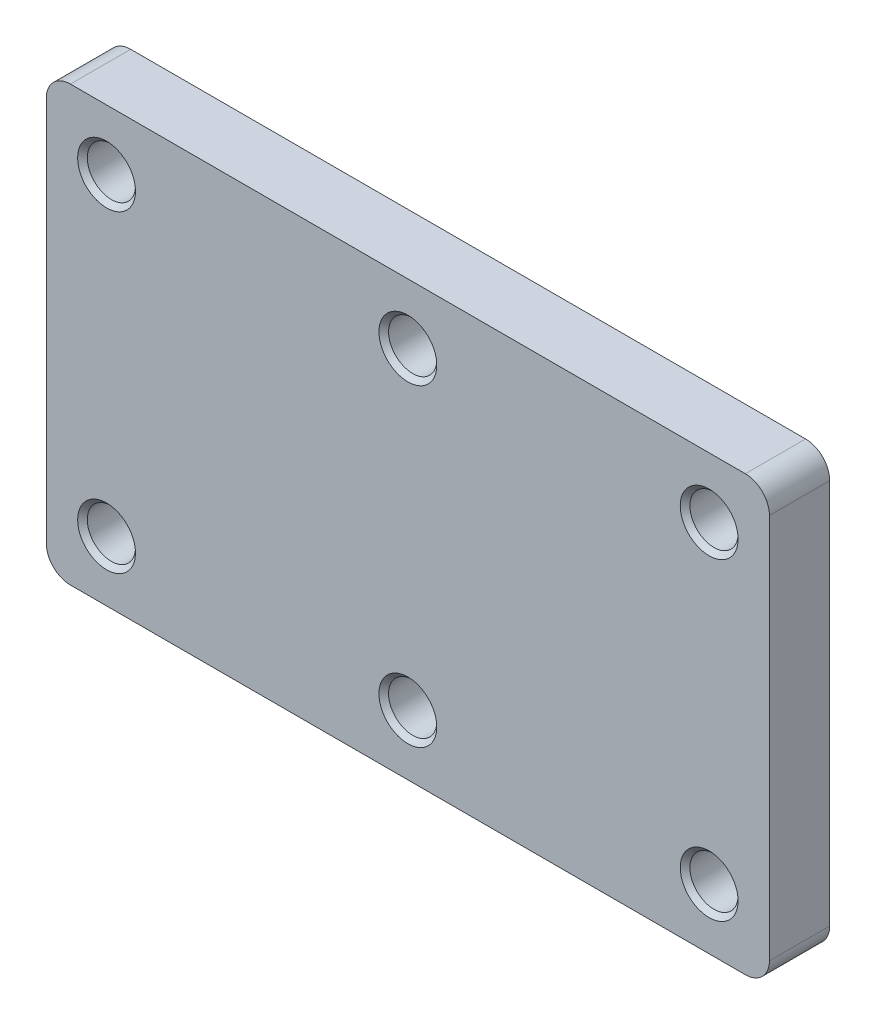
ISO-10303-21;
HEADER;
FILE_DESCRIPTION(('STEP AP214'),'2;1');
FILE_NAME('part.step','',(''),(''),'','','');
FILE_SCHEMA(('AUTOMOTIVE_DESIGN { 1 0 10303 214 1 1 1 1 }'));
ENDSEC;
DATA;
#1=APPLICATION_CONTEXT('core data for automotive mechanical design processes');
#2=APPLICATION_PROTOCOL_DEFINITION('international standard','automotive_design',2000,#1);
#3=PRODUCT_CONTEXT('',#1,'mechanical');
#4=PRODUCT('Part','Part','',(#3));
#5=PRODUCT_RELATED_PRODUCT_CATEGORY('part','',(#4));
#6=PRODUCT_DEFINITION_FORMATION('','',#4);
#7=PRODUCT_DEFINITION_CONTEXT('part definition',#1,'design');
#8=PRODUCT_DEFINITION('design','',#6,#7);
#9=PRODUCT_DEFINITION_SHAPE('','',#8);
#10=(LENGTH_UNIT() NAMED_UNIT(*) SI_UNIT(.MILLI.,.METRE.));
#11=(NAMED_UNIT(*) PLANE_ANGLE_UNIT() SI_UNIT($,.RADIAN.));
#12=(NAMED_UNIT(*) SI_UNIT($,.STERADIAN.) SOLID_ANGLE_UNIT());
#13=UNCERTAINTY_MEASURE_WITH_UNIT(LENGTH_MEASURE(1.E-05),#10,'distance_accuracy_value','');
#14=(GEOMETRIC_REPRESENTATION_CONTEXT(3) GLOBAL_UNCERTAINTY_ASSIGNED_CONTEXT((#13)) GLOBAL_UNIT_ASSIGNED_CONTEXT((#10,
#11,#12)) REPRESENTATION_CONTEXT('',''));
#15=CARTESIAN_POINT('',(0.,0.,0.));
#16=DIRECTION('',(0.,0.,1.));
#17=DIRECTION('',(1.,0.,0.));
#18=AXIS2_PLACEMENT_3D('',#15,#16,#17);
#19=CARTESIAN_POINT('',(0.,0.,25.));
#20=DIRECTION('',(0.,0.,-1.));
#21=DIRECTION('',(-1.,0.,0.));
#22=AXIS2_PLACEMENT_3D('',#19,#20,#21);
#23=PLANE('',#22);
#24=CARTESIAN_POINT('',(275.,25.,25.));
#25=DIRECTION('',(0.,0.,-1.));
#26=DIRECTION('',(-1.,0.,0.));
#27=AXIS2_PLACEMENT_3D('',#24,#25,#26);
#28=CIRCLE('',#27,12.);
#29=CARTESIAN_POINT('',(263.,25.,25.));
#30=VERTEX_POINT('',#29);
#31=EDGE_CURVE('E184',#30,#30,#28,.T.);
#32=ORIENTED_EDGE('',*,*,#31,.T.);
#33=EDGE_LOOP('',(#32));
#34=FACE_BOUND('',#33,.T.);
#35=CARTESIAN_POINT('',(275.,155.,25.));
#36=DIRECTION('',(0.,0.,-1.));
#37=DIRECTION('',(-1.,0.,0.));
#38=AXIS2_PLACEMENT_3D('',#35,#36,#37);
#39=CIRCLE('',#38,12.);
#40=CARTESIAN_POINT('',(263.,155.,25.));
#41=VERTEX_POINT('',#40);
#42=EDGE_CURVE('E181',#41,#41,#39,.T.);
#43=ORIENTED_EDGE('',*,*,#42,.T.);
#44=EDGE_LOOP('',(#43));
#45=FACE_BOUND('',#44,.T.);
#46=CARTESIAN_POINT('',(150.,155.,25.));
#47=DIRECTION('',(0.,0.,-1.));
#48=DIRECTION('',(-1.,0.,0.));
#49=AXIS2_PLACEMENT_3D('',#46,#47,#48);
#50=CIRCLE('',#49,12.);
#51=CARTESIAN_POINT('',(138.,155.,25.));
#52=VERTEX_POINT('',#51);
#53=EDGE_CURVE('E178',#52,#52,#50,.T.);
#54=ORIENTED_EDGE('',*,*,#53,.T.);
#55=EDGE_LOOP('',(#54));
#56=FACE_BOUND('',#55,.T.);
#57=CARTESIAN_POINT('',(25.,155.,25.));
#58=DIRECTION('',(0.,0.,-1.));
#59=DIRECTION('',(-1.,0.,0.));
#60=AXIS2_PLACEMENT_3D('',#57,#58,#59);
#61=CIRCLE('',#60,11.9999999999999);
#62=CARTESIAN_POINT('',(13.0000000000001,155.,25.));
#63=VERTEX_POINT('',#62);
#64=EDGE_CURVE('E175',#63,#63,#61,.T.);
#65=ORIENTED_EDGE('',*,*,#64,.T.);
#66=EDGE_LOOP('',(#65));
#67=FACE_BOUND('',#66,.T.);
#68=CARTESIAN_POINT('',(150.,25.,25.));
#69=DIRECTION('',(0.,0.,-1.));
#70=DIRECTION('',(-1.,0.,0.));
#71=AXIS2_PLACEMENT_3D('',#68,#69,#70);
#72=CIRCLE('',#71,12.);
#73=CARTESIAN_POINT('',(138.,25.,25.));
#74=VERTEX_POINT('',#73);
#75=EDGE_CURVE('E172',#74,#74,#72,.T.);
#76=ORIENTED_EDGE('',*,*,#75,.T.);
#77=EDGE_LOOP('',(#76));
#78=FACE_BOUND('',#77,.T.);
#79=CARTESIAN_POINT('',(25.,25.,25.));
#80=DIRECTION('',(0.,0.,-1.));
#81=DIRECTION('',(-1.,0.,0.));
#82=AXIS2_PLACEMENT_3D('',#79,#80,#81);
#83=CIRCLE('',#82,11.9999999999999);
#84=CARTESIAN_POINT('',(13.0000000000001,25.,25.));
#85=VERTEX_POINT('',#84);
#86=EDGE_CURVE('E169',#85,#85,#83,.T.);
#87=ORIENTED_EDGE('',*,*,#86,.T.);
#88=EDGE_LOOP('',(#87));
#89=FACE_BOUND('',#88,.T.);
#90=DIRECTION('',(1.,0.,0.));
#91=VECTOR('',#90,1.);
#92=CARTESIAN_POINT('',(0.,0.,25.));
#93=LINE('',#92,#91);
#94=CARTESIAN_POINT('',(10.,0.,25.));
#95=VERTEX_POINT('',#94);
#96=CARTESIAN_POINT('',(290.,0.,25.));
#97=VERTEX_POINT('',#96);
#98=EDGE_CURVE('E540',#95,#97,#93,.T.);
#99=ORIENTED_EDGE('',*,*,#98,.T.);
#100=CARTESIAN_POINT('',(290.,10.,25.));
#101=DIRECTION('',(0.,0.,-1.));
#102=DIRECTION('',(-1.,0.,0.));
#103=AXIS2_PLACEMENT_3D('',#100,#101,#102);
#104=CIRCLE('',#103,10.);
#105=CARTESIAN_POINT('',(300.,10.,25.));
#106=VERTEX_POINT('',#105);
#107=EDGE_CURVE('E152',#97,#106,#104,.F.);
#108=ORIENTED_EDGE('',*,*,#107,.T.);
#109=DIRECTION('',(0.,1.,0.));
#110=VECTOR('',#109,1.);
#111=CARTESIAN_POINT('',(300.,0.,25.));
#112=LINE('',#111,#110);
#113=CARTESIAN_POINT('',(300.,170.,25.));
#114=VERTEX_POINT('',#113);
#115=EDGE_CURVE('E123',#106,#114,#112,.T.);
#116=ORIENTED_EDGE('',*,*,#115,.T.);
#117=CARTESIAN_POINT('',(290.,170.,25.));
#118=DIRECTION('',(0.,0.,-1.));
#119=DIRECTION('',(-1.,0.,0.));
#120=AXIS2_PLACEMENT_3D('',#117,#118,#119);
#121=CIRCLE('',#120,10.);
#122=CARTESIAN_POINT('',(290.,180.,25.));
#123=VERTEX_POINT('',#122);
#124=EDGE_CURVE('E59',#114,#123,#121,.F.);
#125=ORIENTED_EDGE('',*,*,#124,.T.);
#126=DIRECTION('',(-1.,0.,0.));
#127=VECTOR('',#126,1.);
#128=CARTESIAN_POINT('',(0.,180.,25.));
#129=LINE('',#128,#127);
#130=CARTESIAN_POINT('',(10.,180.,25.));
#131=VERTEX_POINT('',#130);
#132=EDGE_CURVE('E138',#123,#131,#129,.T.);
#133=ORIENTED_EDGE('',*,*,#132,.T.);
#134=CARTESIAN_POINT('',(10.,170.,25.));
#135=DIRECTION('',(0.,0.,-1.));
#136=DIRECTION('',(-1.,0.,0.));
#137=AXIS2_PLACEMENT_3D('',#134,#135,#136);
#138=CIRCLE('',#137,10.);
#139=CARTESIAN_POINT('',(0.,170.,25.));
#140=VERTEX_POINT('',#139);
#141=EDGE_CURVE('E147',#131,#140,#138,.F.);
#142=ORIENTED_EDGE('',*,*,#141,.T.);
#143=DIRECTION('',(0.,-1.,0.));
#144=VECTOR('',#143,1.);
#145=CARTESIAN_POINT('',(0.,0.,25.));
#146=LINE('',#145,#144);
#147=CARTESIAN_POINT('',(0.,10.,25.));
#148=VERTEX_POINT('',#147);
#149=EDGE_CURVE('E132',#140,#148,#146,.T.);
#150=ORIENTED_EDGE('',*,*,#149,.T.);
#151=CARTESIAN_POINT('',(10.,10.,25.));
#152=DIRECTION('',(0.,0.,-1.));
#153=DIRECTION('',(-1.,0.,0.));
#154=AXIS2_PLACEMENT_3D('',#151,#152,#153);
#155=CIRCLE('',#154,10.);
#156=EDGE_CURVE('E149',#148,#95,#155,.F.);
#157=ORIENTED_EDGE('',*,*,#156,.T.);
#158=EDGE_LOOP('',(#99,#108,#116,#125,#133,#142,#150,#157));
#159=FACE_BOUND('',#158,.T.);
#160=ADVANCED_FACE('F37',(#34,#45,#56,#67,#78,#89,#159),#23,.F.);
#161=CARTESIAN_POINT('',(0.,0.,25.));
#162=DIRECTION('',(1.,0.,0.));
#163=DIRECTION('',(0.,0.,-1.));
#164=AXIS2_PLACEMENT_3D('',#161,#162,#163);
#165=PLANE('',#164);
#166=DIRECTION('',(0.,-1.,0.));
#167=VECTOR('',#166,1.);
#168=CARTESIAN_POINT('',(0.,0.,0.));
#169=LINE('',#168,#167);
#170=CARTESIAN_POINT('',(0.,170.,0.));
#171=VERTEX_POINT('',#170);
#172=CARTESIAN_POINT('',(0.,10.,0.));
#173=VERTEX_POINT('',#172);
#174=EDGE_CURVE('E134',#171,#173,#169,.T.);
#175=ORIENTED_EDGE('',*,*,#174,.T.);
#176=DIRECTION('',(0.,0.,-1.));
#177=VECTOR('',#176,1.);
#178=CARTESIAN_POINT('',(0.,10.,25.));
#179=LINE('',#178,#177);
#180=EDGE_CURVE('E161',#173,#148,#179,.F.);
#181=ORIENTED_EDGE('',*,*,#180,.T.);
#182=ORIENTED_EDGE('',*,*,#149,.F.);
#183=DIRECTION('',(0.,0.,-1.));
#184=VECTOR('',#183,1.);
#185=CARTESIAN_POINT('',(0.,170.,25.));
#186=LINE('',#185,#184);
#187=EDGE_CURVE('E158',#140,#171,#186,.T.);
#188=ORIENTED_EDGE('',*,*,#187,.T.);
#189=EDGE_LOOP('',(#175,#181,#182,#188));
#190=FACE_BOUND('',#189,.T.);
#191=ADVANCED_FACE('F243',(#190),#165,.F.);
#192=CARTESIAN_POINT('',(0.,0.,25.));
#193=DIRECTION('',(0.,1.,0.));
#194=DIRECTION('',(0.,0.,1.));
#195=AXIS2_PLACEMENT_3D('',#192,#193,#194);
#196=PLANE('',#195);
#197=DIRECTION('',(1.,0.,0.));
#198=VECTOR('',#197,1.);
#199=CARTESIAN_POINT('',(0.,0.,0.));
#200=LINE('',#199,#198);
#201=CARTESIAN_POINT('',(10.,0.,0.));
#202=VERTEX_POINT('',#201);
#203=CARTESIAN_POINT('',(290.,0.,0.));
#204=VERTEX_POINT('',#203);
#205=EDGE_CURVE('E130',#202,#204,#200,.T.);
#206=ORIENTED_EDGE('',*,*,#205,.T.);
#207=DIRECTION('',(0.,0.,-1.));
#208=VECTOR('',#207,1.);
#209=CARTESIAN_POINT('',(290.,0.,25.));
#210=LINE('',#209,#208);
#211=EDGE_CURVE('E109',#204,#97,#210,.F.);
#212=ORIENTED_EDGE('',*,*,#211,.T.);
#213=ORIENTED_EDGE('',*,*,#98,.F.);
#214=DIRECTION('',(0.,0.,-1.));
#215=VECTOR('',#214,1.);
#216=CARTESIAN_POINT('',(10.,0.,25.));
#217=LINE('',#216,#215);
#218=EDGE_CURVE('E114',#95,#202,#217,.T.);
#219=ORIENTED_EDGE('',*,*,#218,.T.);
#220=EDGE_LOOP('',(#206,#212,#213,#219));
#221=FACE_BOUND('',#220,.T.);
#222=ADVANCED_FACE('F249',(#221),#196,.F.);
#223=CARTESIAN_POINT('',(300.,0.,25.));
#224=DIRECTION('',(-1.,0.,0.));
#225=DIRECTION('',(0.,0.,1.));
#226=AXIS2_PLACEMENT_3D('',#223,#224,#225);
#227=PLANE('',#226);
#228=ORIENTED_EDGE('',*,*,#115,.F.);
#229=DIRECTION('',(0.,0.,-1.));
#230=VECTOR('',#229,1.);
#231=CARTESIAN_POINT('',(300.,10.,25.));
#232=LINE('',#231,#230);
#233=CARTESIAN_POINT('',(300.,10.,0.));
#234=VERTEX_POINT('',#233);
#235=EDGE_CURVE('E108',#106,#234,#232,.T.);
#236=ORIENTED_EDGE('',*,*,#235,.T.);
#237=DIRECTION('',(0.,1.,0.));
#238=VECTOR('',#237,1.);
#239=CARTESIAN_POINT('',(300.,0.,0.));
#240=LINE('',#239,#238);
#241=CARTESIAN_POINT('',(300.,170.,0.));
#242=VERTEX_POINT('',#241);
#243=EDGE_CURVE('E121',#234,#242,#240,.T.);
#244=ORIENTED_EDGE('',*,*,#243,.T.);
#245=DIRECTION('',(0.,0.,-1.));
#246=VECTOR('',#245,1.);
#247=CARTESIAN_POINT('',(300.,170.,25.));
#248=LINE('',#247,#246);
#249=EDGE_CURVE('E125',#242,#114,#248,.F.);
#250=ORIENTED_EDGE('',*,*,#249,.T.);
#251=EDGE_LOOP('',(#228,#236,#244,#250));
#252=FACE_BOUND('',#251,.T.);
#253=ADVANCED_FACE('F120',(#252),#227,.F.);
#254=CARTESIAN_POINT('',(0.,180.,25.));
#255=DIRECTION('',(0.,-1.,0.));
#256=DIRECTION('',(0.,0.,-1.));
#257=AXIS2_PLACEMENT_3D('',#254,#255,#256);
#258=PLANE('',#257);
#259=ORIENTED_EDGE('',*,*,#132,.F.);
#260=DIRECTION('',(0.,0.,-1.));
#261=VECTOR('',#260,1.);
#262=CARTESIAN_POINT('',(290.,180.,25.));
#263=LINE('',#262,#261);
#264=CARTESIAN_POINT('',(290.,180.,0.));
#265=VERTEX_POINT('',#264);
#266=EDGE_CURVE('E155',#123,#265,#263,.T.);
#267=ORIENTED_EDGE('',*,*,#266,.T.);
#268=DIRECTION('',(-1.,0.,0.));
#269=VECTOR('',#268,1.);
#270=CARTESIAN_POINT('',(0.,180.,0.));
#271=LINE('',#270,#269);
#272=CARTESIAN_POINT('',(10.,180.,0.));
#273=VERTEX_POINT('',#272);
#274=EDGE_CURVE('E129',#265,#273,#271,.T.);
#275=ORIENTED_EDGE('',*,*,#274,.T.);
#276=DIRECTION('',(0.,0.,-1.));
#277=VECTOR('',#276,1.);
#278=CARTESIAN_POINT('',(10.,180.,25.));
#279=LINE('',#278,#277);
#280=EDGE_CURVE('E52',#273,#131,#279,.F.);
#281=ORIENTED_EDGE('',*,*,#280,.T.);
#282=EDGE_LOOP('',(#259,#267,#275,#281));
#283=FACE_BOUND('',#282,.T.);
#284=ADVANCED_FACE('F259',(#283),#258,.F.);
#285=CARTESIAN_POINT('',(0.,0.,0.));
#286=DIRECTION('',(0.,0.,-1.));
#287=DIRECTION('',(-1.,0.,0.));
#288=AXIS2_PLACEMENT_3D('',#285,#286,#287);
#289=PLANE('',#288);
#290=CARTESIAN_POINT('',(275.,25.,0.));
#291=DIRECTION('',(0.,0.,-1.));
#292=DIRECTION('',(-1.,0.,0.));
#293=AXIS2_PLACEMENT_3D('',#290,#291,#292);
#294=CIRCLE('',#293,12.);
#295=CARTESIAN_POINT('',(263.,25.,0.));
#296=VERTEX_POINT('',#295);
#297=EDGE_CURVE('E202',#296,#296,#294,.F.);
#298=ORIENTED_EDGE('',*,*,#297,.T.);
#299=EDGE_LOOP('',(#298));
#300=FACE_BOUND('',#299,.T.);
#301=CARTESIAN_POINT('',(275.,155.,0.));
#302=DIRECTION('',(0.,0.,-1.));
#303=DIRECTION('',(-1.,0.,0.));
#304=AXIS2_PLACEMENT_3D('',#301,#302,#303);
#305=CIRCLE('',#304,12.);
#306=CARTESIAN_POINT('',(263.,155.,0.));
#307=VERTEX_POINT('',#306);
#308=EDGE_CURVE('E199',#307,#307,#305,.F.);
#309=ORIENTED_EDGE('',*,*,#308,.T.);
#310=EDGE_LOOP('',(#309));
#311=FACE_BOUND('',#310,.T.);
#312=CARTESIAN_POINT('',(150.,155.,0.));
#313=DIRECTION('',(0.,0.,-1.));
#314=DIRECTION('',(-1.,0.,0.));
#315=AXIS2_PLACEMENT_3D('',#312,#313,#314);
#316=CIRCLE('',#315,12.);
#317=CARTESIAN_POINT('',(138.,155.,0.));
#318=VERTEX_POINT('',#317);
#319=EDGE_CURVE('E196',#318,#318,#316,.F.);
#320=ORIENTED_EDGE('',*,*,#319,.T.);
#321=EDGE_LOOP('',(#320));
#322=FACE_BOUND('',#321,.T.);
#323=CARTESIAN_POINT('',(25.,155.,0.));
#324=DIRECTION('',(0.,0.,-1.));
#325=DIRECTION('',(-1.,0.,0.));
#326=AXIS2_PLACEMENT_3D('',#323,#324,#325);
#327=CIRCLE('',#326,11.9999999999999);
#328=CARTESIAN_POINT('',(13.0000000000001,155.,0.));
#329=VERTEX_POINT('',#328);
#330=EDGE_CURVE('E193',#329,#329,#327,.F.);
#331=ORIENTED_EDGE('',*,*,#330,.T.);
#332=EDGE_LOOP('',(#331));
#333=FACE_BOUND('',#332,.T.);
#334=CARTESIAN_POINT('',(150.,25.,0.));
#335=DIRECTION('',(0.,0.,-1.));
#336=DIRECTION('',(-1.,0.,0.));
#337=AXIS2_PLACEMENT_3D('',#334,#335,#336);
#338=CIRCLE('',#337,12.);
#339=CARTESIAN_POINT('',(138.,25.,0.));
#340=VERTEX_POINT('',#339);
#341=EDGE_CURVE('E190',#340,#340,#338,.F.);
#342=ORIENTED_EDGE('',*,*,#341,.T.);
#343=EDGE_LOOP('',(#342));
#344=FACE_BOUND('',#343,.T.);
#345=CARTESIAN_POINT('',(25.,25.,0.));
#346=DIRECTION('',(0.,0.,-1.));
#347=DIRECTION('',(-1.,0.,0.));
#348=AXIS2_PLACEMENT_3D('',#345,#346,#347);
#349=CIRCLE('',#348,11.9999999999999);
#350=CARTESIAN_POINT('',(13.0000000000001,25.,0.));
#351=VERTEX_POINT('',#350);
#352=EDGE_CURVE('E187',#351,#351,#349,.F.);
#353=ORIENTED_EDGE('',*,*,#352,.T.);
#354=EDGE_LOOP('',(#353));
#355=FACE_BOUND('',#354,.T.);
#356=ORIENTED_EDGE('',*,*,#243,.F.);
#357=CARTESIAN_POINT('',(290.,10.,0.));
#358=DIRECTION('',(0.,0.,-1.));
#359=DIRECTION('',(-1.,0.,0.));
#360=AXIS2_PLACEMENT_3D('',#357,#358,#359);
#361=CIRCLE('',#360,10.);
#362=EDGE_CURVE('E104',#234,#204,#361,.T.);
#363=ORIENTED_EDGE('',*,*,#362,.T.);
#364=ORIENTED_EDGE('',*,*,#205,.F.);
#365=CARTESIAN_POINT('',(10.,10.,0.));
#366=DIRECTION('',(0.,0.,-1.));
#367=DIRECTION('',(-1.,0.,0.));
#368=AXIS2_PLACEMENT_3D('',#365,#366,#367);
#369=CIRCLE('',#368,10.);
#370=EDGE_CURVE('E141',#202,#173,#369,.T.);
#371=ORIENTED_EDGE('',*,*,#370,.T.);
#372=ORIENTED_EDGE('',*,*,#174,.F.);
#373=CARTESIAN_POINT('',(10.,170.,0.));
#374=DIRECTION('',(0.,0.,-1.));
#375=DIRECTION('',(-1.,0.,0.));
#376=AXIS2_PLACEMENT_3D('',#373,#374,#375);
#377=CIRCLE('',#376,10.);
#378=EDGE_CURVE('E124',#171,#273,#377,.T.);
#379=ORIENTED_EDGE('',*,*,#378,.T.);
#380=ORIENTED_EDGE('',*,*,#274,.F.);
#381=CARTESIAN_POINT('',(290.,170.,0.));
#382=DIRECTION('',(0.,0.,-1.));
#383=DIRECTION('',(-1.,0.,0.));
#384=AXIS2_PLACEMENT_3D('',#381,#382,#383);
#385=CIRCLE('',#384,10.);
#386=EDGE_CURVE('E115',#265,#242,#385,.T.);
#387=ORIENTED_EDGE('',*,*,#386,.T.);
#388=EDGE_LOOP('',(#356,#363,#364,#371,#372,#379,#380,#387));
#389=FACE_BOUND('',#388,.T.);
#390=ADVANCED_FACE('F127',(#300,#311,#322,#333,#344,#355,#389),#289,.T.);
#391=CARTESIAN_POINT('',(290.,10.,25.));
#392=DIRECTION('',(0.,0.,-1.));
#393=DIRECTION('',(-1.,0.,0.));
#394=AXIS2_PLACEMENT_3D('',#391,#392,#393);
#395=CYLINDRICAL_SURFACE('',#394,10.);
#396=ORIENTED_EDGE('',*,*,#107,.F.);
#397=ORIENTED_EDGE('',*,*,#211,.F.);
#398=ORIENTED_EDGE('',*,*,#362,.F.);
#399=ORIENTED_EDGE('',*,*,#235,.F.);
#400=EDGE_LOOP('',(#396,#397,#398,#399));
#401=FACE_BOUND('',#400,.T.);
#402=ADVANCED_FACE('F107',(#401),#395,.T.);
#403=CARTESIAN_POINT('',(290.,170.,25.));
#404=DIRECTION('',(0.,0.,-1.));
#405=DIRECTION('',(-1.,0.,0.));
#406=AXIS2_PLACEMENT_3D('',#403,#404,#405);
#407=CYLINDRICAL_SURFACE('',#406,10.);
#408=ORIENTED_EDGE('',*,*,#124,.F.);
#409=ORIENTED_EDGE('',*,*,#249,.F.);
#410=ORIENTED_EDGE('',*,*,#386,.F.);
#411=ORIENTED_EDGE('',*,*,#266,.F.);
#412=EDGE_LOOP('',(#408,#409,#410,#411));
#413=FACE_BOUND('',#412,.T.);
#414=ADVANCED_FACE('F270',(#413),#407,.T.);
#415=CARTESIAN_POINT('',(10.,10.,25.));
#416=DIRECTION('',(0.,0.,-1.));
#417=DIRECTION('',(-1.,0.,0.));
#418=AXIS2_PLACEMENT_3D('',#415,#416,#417);
#419=CYLINDRICAL_SURFACE('',#418,10.);
#420=ORIENTED_EDGE('',*,*,#156,.F.);
#421=ORIENTED_EDGE('',*,*,#180,.F.);
#422=ORIENTED_EDGE('',*,*,#370,.F.);
#423=ORIENTED_EDGE('',*,*,#218,.F.);
#424=EDGE_LOOP('',(#420,#421,#422,#423));
#425=FACE_BOUND('',#424,.T.);
#426=ADVANCED_FACE('F273',(#425),#419,.T.);
#427=CARTESIAN_POINT('',(10.,170.,25.));
#428=DIRECTION('',(0.,0.,-1.));
#429=DIRECTION('',(-1.,0.,0.));
#430=AXIS2_PLACEMENT_3D('',#427,#428,#429);
#431=CYLINDRICAL_SURFACE('',#430,10.);
#432=ORIENTED_EDGE('',*,*,#141,.F.);
#433=ORIENTED_EDGE('',*,*,#280,.F.);
#434=ORIENTED_EDGE('',*,*,#378,.F.);
#435=ORIENTED_EDGE('',*,*,#187,.F.);
#436=EDGE_LOOP('',(#432,#433,#434,#435));
#437=FACE_BOUND('',#436,.T.);
#438=ADVANCED_FACE('F277',(#437),#431,.T.);
#439=CARTESIAN_POINT('',(275.,155.,25.));
#440=DIRECTION('',(0.,0.,1.));
#441=DIRECTION('',(1.,0.,0.));
#442=AXIS2_PLACEMENT_3D('',#439,#440,#441);
#443=CYLINDRICAL_SURFACE('',#442,10.);
#444=CARTESIAN_POINT('',(275.,155.,23.));
#445=DIRECTION('',(0.,0.,-1.));
#446=DIRECTION('',(-1.,0.,0.));
#447=AXIS2_PLACEMENT_3D('',#444,#445,#446);
#448=CIRCLE('',#447,10.);
#449=CARTESIAN_POINT('',(265.,155.,23.));
#450=VERTEX_POINT('',#449);
#451=EDGE_CURVE('E208',#450,#450,#448,.F.);
#452=ORIENTED_EDGE('',*,*,#451,.T.);
#453=EDGE_LOOP('',(#452));
#454=FACE_BOUND('',#453,.T.);
#455=CARTESIAN_POINT('',(275.,155.,1.99999999999998));
#456=DIRECTION('',(0.,0.,-1.));
#457=DIRECTION('',(-1.,0.,0.));
#458=AXIS2_PLACEMENT_3D('',#455,#456,#457);
#459=CIRCLE('',#458,10.);
#460=CARTESIAN_POINT('',(265.,155.,1.99999999999998));
#461=VERTEX_POINT('',#460);
#462=EDGE_CURVE('E205',#461,#461,#459,.T.);
#463=ORIENTED_EDGE('',*,*,#462,.T.);
#464=EDGE_LOOP('',(#463));
#465=FACE_BOUND('',#464,.T.);
#466=ADVANCED_FACE('F255',(#454,#465),#443,.F.);
#467=CARTESIAN_POINT('',(275.,25.,25.));
#468=DIRECTION('',(0.,0.,1.));
#469=DIRECTION('',(1.,0.,0.));
#470=AXIS2_PLACEMENT_3D('',#467,#468,#469);
#471=CYLINDRICAL_SURFACE('',#470,10.);
#472=CARTESIAN_POINT('',(275.,25.,23.));
#473=DIRECTION('',(0.,0.,-1.));
#474=DIRECTION('',(-1.,0.,0.));
#475=AXIS2_PLACEMENT_3D('',#472,#473,#474);
#476=CIRCLE('',#475,10.);
#477=CARTESIAN_POINT('',(265.,25.,23.));
#478=VERTEX_POINT('',#477);
#479=EDGE_CURVE('E166',#478,#478,#476,.F.);
#480=ORIENTED_EDGE('',*,*,#479,.T.);
#481=EDGE_LOOP('',(#480));
#482=FACE_BOUND('',#481,.T.);
#483=CARTESIAN_POINT('',(275.,25.,1.99999999999998));
#484=DIRECTION('',(0.,0.,-1.));
#485=DIRECTION('',(-1.,0.,0.));
#486=AXIS2_PLACEMENT_3D('',#483,#484,#485);
#487=CIRCLE('',#486,10.);
#488=CARTESIAN_POINT('',(265.,25.,1.99999999999998));
#489=VERTEX_POINT('',#488);
#490=EDGE_CURVE('E163',#489,#489,#487,.T.);
#491=ORIENTED_EDGE('',*,*,#490,.T.);
#492=EDGE_LOOP('',(#491));
#493=FACE_BOUND('',#492,.T.);
#494=ADVANCED_FACE('F342',(#482,#493),#471,.F.);
#495=CARTESIAN_POINT('',(150.,155.,25.));
#496=DIRECTION('',(0.,0.,1.));
#497=DIRECTION('',(1.,0.,0.));
#498=AXIS2_PLACEMENT_3D('',#495,#496,#497);
#499=CYLINDRICAL_SURFACE('',#498,9.99999999999998);
#500=CARTESIAN_POINT('',(150.,155.,23.));
#501=DIRECTION('',(0.,0.,-1.));
#502=DIRECTION('',(-1.,0.,0.));
#503=AXIS2_PLACEMENT_3D('',#500,#501,#502);
#504=CIRCLE('',#503,9.99999999999998);
#505=CARTESIAN_POINT('',(140.,155.,23.));
#506=VERTEX_POINT('',#505);
#507=EDGE_CURVE('E214',#506,#506,#504,.F.);
#508=ORIENTED_EDGE('',*,*,#507,.T.);
#509=EDGE_LOOP('',(#508));
#510=FACE_BOUND('',#509,.T.);
#511=CARTESIAN_POINT('',(150.,155.,2.00000000000001));
#512=DIRECTION('',(0.,0.,-1.));
#513=DIRECTION('',(-1.,0.,0.));
#514=AXIS2_PLACEMENT_3D('',#511,#512,#513);
#515=CIRCLE('',#514,9.99999999999998);
#516=CARTESIAN_POINT('',(140.,155.,2.00000000000001));
#517=VERTEX_POINT('',#516);
#518=EDGE_CURVE('E211',#517,#517,#515,.T.);
#519=ORIENTED_EDGE('',*,*,#518,.T.);
#520=EDGE_LOOP('',(#519));
#521=FACE_BOUND('',#520,.T.);
#522=ADVANCED_FACE('F339',(#510,#521),#499,.F.);
#523=CARTESIAN_POINT('',(25.,155.,25.));
#524=DIRECTION('',(0.,0.,1.));
#525=DIRECTION('',(1.,0.,0.));
#526=AXIS2_PLACEMENT_3D('',#523,#524,#525);
#527=CYLINDRICAL_SURFACE('',#526,9.99999999999999);
#528=CARTESIAN_POINT('',(25.,155.,23.0000000000001));
#529=DIRECTION('',(0.,0.,-1.));
#530=DIRECTION('',(-1.,0.,0.));
#531=AXIS2_PLACEMENT_3D('',#528,#529,#530);
#532=CIRCLE('',#531,9.99999999999999);
#533=CARTESIAN_POINT('',(15.,155.,23.0000000000001));
#534=VERTEX_POINT('',#533);
#535=EDGE_CURVE('E220',#534,#534,#532,.F.);
#536=ORIENTED_EDGE('',*,*,#535,.T.);
#537=EDGE_LOOP('',(#536));
#538=FACE_BOUND('',#537,.T.);
#539=CARTESIAN_POINT('',(25.,155.,1.99999999999992));
#540=DIRECTION('',(0.,0.,-1.));
#541=DIRECTION('',(-1.,0.,0.));
#542=AXIS2_PLACEMENT_3D('',#539,#540,#541);
#543=CIRCLE('',#542,9.99999999999999);
#544=CARTESIAN_POINT('',(15.,155.,1.99999999999992));
#545=VERTEX_POINT('',#544);
#546=EDGE_CURVE('E217',#545,#545,#543,.T.);
#547=ORIENTED_EDGE('',*,*,#546,.T.);
#548=EDGE_LOOP('',(#547));
#549=FACE_BOUND('',#548,.T.);
#550=ADVANCED_FACE('F333',(#538,#549),#527,.F.);
#551=CARTESIAN_POINT('',(25.,25.,25.));
#552=DIRECTION('',(0.,0.,1.));
#553=DIRECTION('',(1.,0.,0.));
#554=AXIS2_PLACEMENT_3D('',#551,#552,#553);
#555=CYLINDRICAL_SURFACE('',#554,9.99999999999999);
#556=CARTESIAN_POINT('',(25.,25.,23.0000000000001));
#557=DIRECTION('',(0.,0.,-1.));
#558=DIRECTION('',(-1.,0.,0.));
#559=AXIS2_PLACEMENT_3D('',#556,#557,#558);
#560=CIRCLE('',#559,9.99999999999999);
#561=CARTESIAN_POINT('',(15.,25.,23.0000000000001));
#562=VERTEX_POINT('',#561);
#563=EDGE_CURVE('E11',#562,#562,#560,.F.);
#564=ORIENTED_EDGE('',*,*,#563,.T.);
#565=EDGE_LOOP('',(#564));
#566=FACE_BOUND('',#565,.T.);
#567=CARTESIAN_POINT('',(25.,25.,1.99999999999992));
#568=DIRECTION('',(0.,0.,-1.));
#569=DIRECTION('',(-1.,0.,0.));
#570=AXIS2_PLACEMENT_3D('',#567,#568,#569);
#571=CIRCLE('',#570,9.99999999999999);
#572=CARTESIAN_POINT('',(15.,25.,1.99999999999992));
#573=VERTEX_POINT('',#572);
#574=EDGE_CURVE('E45',#573,#573,#571,.T.);
#575=ORIENTED_EDGE('',*,*,#574,.T.);
#576=EDGE_LOOP('',(#575));
#577=FACE_BOUND('',#576,.T.);
#578=ADVANCED_FACE('F231',(#566,#577),#555,.F.);
#579=CARTESIAN_POINT('',(150.,25.,25.));
#580=DIRECTION('',(0.,0.,1.));
#581=DIRECTION('',(1.,0.,0.));
#582=AXIS2_PLACEMENT_3D('',#579,#580,#581);
#583=CYLINDRICAL_SURFACE('',#582,9.99999999999998);
#584=CARTESIAN_POINT('',(150.,25.,23.));
#585=DIRECTION('',(0.,0.,-1.));
#586=DIRECTION('',(-1.,0.,0.));
#587=AXIS2_PLACEMENT_3D('',#584,#585,#586);
#588=CIRCLE('',#587,9.99999999999998);
#589=CARTESIAN_POINT('',(140.,25.,23.));
#590=VERTEX_POINT('',#589);
#591=EDGE_CURVE('E226',#590,#590,#588,.F.);
#592=ORIENTED_EDGE('',*,*,#591,.T.);
#593=EDGE_LOOP('',(#592));
#594=FACE_BOUND('',#593,.T.);
#595=CARTESIAN_POINT('',(150.,25.,2.00000000000001));
#596=DIRECTION('',(0.,0.,-1.));
#597=DIRECTION('',(-1.,0.,0.));
#598=AXIS2_PLACEMENT_3D('',#595,#596,#597);
#599=CIRCLE('',#598,9.99999999999998);
#600=CARTESIAN_POINT('',(140.,25.,2.00000000000001));
#601=VERTEX_POINT('',#600);
#602=EDGE_CURVE('E223',#601,#601,#599,.T.);
#603=ORIENTED_EDGE('',*,*,#602,.T.);
#604=EDGE_LOOP('',(#603));
#605=FACE_BOUND('',#604,.T.);
#606=ADVANCED_FACE('F286',(#594,#605),#583,.F.);
#607=CARTESIAN_POINT('',(275.,25.,23.));
#608=DIRECTION('',(0.,0.,1.));
#609=DIRECTION('',(1.,0.,0.));
#610=AXIS2_PLACEMENT_3D('',#607,#608,#609);
#611=CONICAL_SURFACE('',#610,10.,0.785398163397447);
#612=ORIENTED_EDGE('',*,*,#31,.F.);
#613=EDGE_LOOP('',(#612));
#614=FACE_BOUND('',#613,.T.);
#615=ORIENTED_EDGE('',*,*,#479,.F.);
#616=EDGE_LOOP('',(#615));
#617=FACE_BOUND('',#616,.T.);
#618=ADVANCED_FACE('F282',(#614,#617),#611,.F.);
#619=CARTESIAN_POINT('',(275.,25.,1.99999999999998));
#620=DIRECTION('',(0.,0.,-1.));
#621=DIRECTION('',(-1.,0.,0.));
#622=AXIS2_PLACEMENT_3D('',#619,#620,#621);
#623=CONICAL_SURFACE('',#622,10.,0.785398163397454);
#624=ORIENTED_EDGE('',*,*,#297,.F.);
#625=EDGE_LOOP('',(#624));
#626=FACE_BOUND('',#625,.T.);
#627=ORIENTED_EDGE('',*,*,#490,.F.);
#628=EDGE_LOOP('',(#627));
#629=FACE_BOUND('',#628,.T.);
#630=ADVANCED_FACE('F285',(#626,#629),#623,.F.);
#631=CARTESIAN_POINT('',(275.,155.,23.));
#632=DIRECTION('',(0.,0.,1.));
#633=DIRECTION('',(1.,0.,0.));
#634=AXIS2_PLACEMENT_3D('',#631,#632,#633);
#635=CONICAL_SURFACE('',#634,10.,0.785398163397447);
#636=ORIENTED_EDGE('',*,*,#42,.F.);
#637=EDGE_LOOP('',(#636));
#638=FACE_BOUND('',#637,.T.);
#639=ORIENTED_EDGE('',*,*,#451,.F.);
#640=EDGE_LOOP('',(#639));
#641=FACE_BOUND('',#640,.T.);
#642=ADVANCED_FACE('F290',(#638,#641),#635,.F.);
#643=CARTESIAN_POINT('',(275.,155.,1.99999999999998));
#644=DIRECTION('',(0.,0.,-1.));
#645=DIRECTION('',(-1.,0.,0.));
#646=AXIS2_PLACEMENT_3D('',#643,#644,#645);
#647=CONICAL_SURFACE('',#646,10.,0.785398163397454);
#648=ORIENTED_EDGE('',*,*,#308,.F.);
#649=EDGE_LOOP('',(#648));
#650=FACE_BOUND('',#649,.T.);
#651=ORIENTED_EDGE('',*,*,#462,.F.);
#652=EDGE_LOOP('',(#651));
#653=FACE_BOUND('',#652,.T.);
#654=ADVANCED_FACE('F294',(#650,#653),#647,.F.);
#655=CARTESIAN_POINT('',(150.,155.,23.));
#656=DIRECTION('',(0.,0.,1.));
#657=DIRECTION('',(1.,0.,0.));
#658=AXIS2_PLACEMENT_3D('',#655,#656,#657);
#659=CONICAL_SURFACE('',#658,9.99999999999998,0.785398163397447);
#660=ORIENTED_EDGE('',*,*,#53,.F.);
#661=EDGE_LOOP('',(#660));
#662=FACE_BOUND('',#661,.T.);
#663=ORIENTED_EDGE('',*,*,#507,.F.);
#664=EDGE_LOOP('',(#663));
#665=FACE_BOUND('',#664,.T.);
#666=ADVANCED_FACE('F298',(#662,#665),#659,.F.);
#667=CARTESIAN_POINT('',(150.,155.,2.00000000000001));
#668=DIRECTION('',(0.,0.,-1.));
#669=DIRECTION('',(-1.,0.,0.));
#670=AXIS2_PLACEMENT_3D('',#667,#668,#669);
#671=CONICAL_SURFACE('',#670,9.99999999999998,0.785398163397447);
#672=ORIENTED_EDGE('',*,*,#319,.F.);
#673=EDGE_LOOP('',(#672));
#674=FACE_BOUND('',#673,.T.);
#675=ORIENTED_EDGE('',*,*,#518,.F.);
#676=EDGE_LOOP('',(#675));
#677=FACE_BOUND('',#676,.T.);
#678=ADVANCED_FACE('F302',(#674,#677),#671,.F.);
#679=CARTESIAN_POINT('',(25.,155.,23.0000000000001));
#680=DIRECTION('',(0.,0.,1.));
#681=DIRECTION('',(1.,0.,0.));
#682=AXIS2_PLACEMENT_3D('',#679,#680,#681);
#683=CONICAL_SURFACE('',#682,9.99999999999999,0.785398163397453);
#684=ORIENTED_EDGE('',*,*,#64,.F.);
#685=EDGE_LOOP('',(#684));
#686=FACE_BOUND('',#685,.T.);
#687=ORIENTED_EDGE('',*,*,#535,.F.);
#688=EDGE_LOOP('',(#687));
#689=FACE_BOUND('',#688,.T.);
#690=ADVANCED_FACE('F306',(#686,#689),#683,.F.);
#691=CARTESIAN_POINT('',(25.,155.,1.99999999999992));
#692=DIRECTION('',(0.,0.,-1.));
#693=DIRECTION('',(-1.,0.,0.));
#694=AXIS2_PLACEMENT_3D('',#691,#692,#693);
#695=CONICAL_SURFACE('',#694,9.99999999999999,0.785398163397453);
#696=ORIENTED_EDGE('',*,*,#330,.F.);
#697=EDGE_LOOP('',(#696));
#698=FACE_BOUND('',#697,.T.);
#699=ORIENTED_EDGE('',*,*,#546,.F.);
#700=EDGE_LOOP('',(#699));
#701=FACE_BOUND('',#700,.T.);
#702=ADVANCED_FACE('F310',(#698,#701),#695,.F.);
#703=CARTESIAN_POINT('',(150.,25.,23.));
#704=DIRECTION('',(0.,0.,1.));
#705=DIRECTION('',(1.,0.,0.));
#706=AXIS2_PLACEMENT_3D('',#703,#704,#705);
#707=CONICAL_SURFACE('',#706,9.99999999999998,0.785398163397447);
#708=ORIENTED_EDGE('',*,*,#75,.F.);
#709=EDGE_LOOP('',(#708));
#710=FACE_BOUND('',#709,.T.);
#711=ORIENTED_EDGE('',*,*,#591,.F.);
#712=EDGE_LOOP('',(#711));
#713=FACE_BOUND('',#712,.T.);
#714=ADVANCED_FACE('F314',(#710,#713),#707,.F.);
#715=CARTESIAN_POINT('',(150.,25.,2.00000000000001));
#716=DIRECTION('',(0.,0.,-1.));
#717=DIRECTION('',(-1.,0.,0.));
#718=AXIS2_PLACEMENT_3D('',#715,#716,#717);
#719=CONICAL_SURFACE('',#718,9.99999999999998,0.785398163397447);
#720=ORIENTED_EDGE('',*,*,#341,.F.);
#721=EDGE_LOOP('',(#720));
#722=FACE_BOUND('',#721,.T.);
#723=ORIENTED_EDGE('',*,*,#602,.F.);
#724=EDGE_LOOP('',(#723));
#725=FACE_BOUND('',#724,.T.);
#726=ADVANCED_FACE('F239',(#722,#725),#719,.F.);
#727=CARTESIAN_POINT('',(25.,25.,23.0000000000001));
#728=DIRECTION('',(0.,0.,1.));
#729=DIRECTION('',(1.,0.,0.));
#730=AXIS2_PLACEMENT_3D('',#727,#728,#729);
#731=CONICAL_SURFACE('',#730,9.99999999999999,0.785398163397453);
#732=ORIENTED_EDGE('',*,*,#86,.F.);
#733=EDGE_LOOP('',(#732));
#734=FACE_BOUND('',#733,.T.);
#735=ORIENTED_EDGE('',*,*,#563,.F.);
#736=EDGE_LOOP('',(#735));
#737=FACE_BOUND('',#736,.T.);
#738=ADVANCED_FACE('F234',(#734,#737),#731,.F.);
#739=CARTESIAN_POINT('',(25.,25.,1.99999999999992));
#740=DIRECTION('',(0.,0.,-1.));
#741=DIRECTION('',(-1.,0.,0.));
#742=AXIS2_PLACEMENT_3D('',#739,#740,#741);
#743=CONICAL_SURFACE('',#742,9.99999999999999,0.785398163397453);
#744=ORIENTED_EDGE('',*,*,#352,.F.);
#745=EDGE_LOOP('',(#744));
#746=FACE_BOUND('',#745,.T.);
#747=ORIENTED_EDGE('',*,*,#574,.F.);
#748=EDGE_LOOP('',(#747));
#749=FACE_BOUND('',#748,.T.);
#750=ADVANCED_FACE('F39',(#746,#749),#743,.F.);
#751=CLOSED_SHELL('',(#160,#191,#222,#253,#284,#390,#402,#414,#426,#438,#466,#494,#522,#550,
#578,#606,#618,#630,#642,#654,#666,#678,#690,#702,#714,#726,#738,#750));
#752=MANIFOLD_SOLID_BREP('B2',#751);
#753=ADVANCED_BREP_SHAPE_REPRESENTATION('',(#18,#752),#14);
#754=SHAPE_DEFINITION_REPRESENTATION(#9,#753);
ENDSEC;
END-ISO-10303-21;
